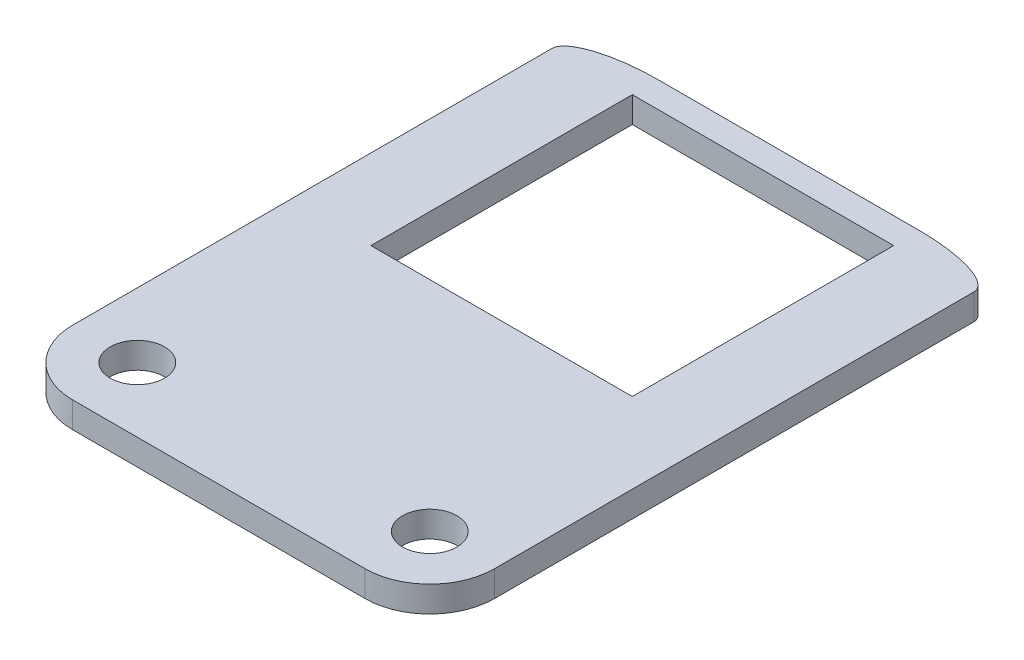
ISO-10303-21;
HEADER;
FILE_DESCRIPTION(('STEP AP214'),'2;1');
FILE_NAME('part.step','',(''),(''),'','','');
FILE_SCHEMA(('AUTOMOTIVE_DESIGN { 1 0 10303 214 1 1 1 1 }'));
ENDSEC;
DATA;
#1=APPLICATION_CONTEXT('core data for automotive mechanical design processes');
#2=APPLICATION_PROTOCOL_DEFINITION('international standard','automotive_design',2000,#1);
#3=PRODUCT_CONTEXT('',#1,'mechanical');
#4=PRODUCT('Part','Part','',(#3));
#5=PRODUCT_RELATED_PRODUCT_CATEGORY('part','',(#4));
#6=PRODUCT_DEFINITION_FORMATION('','',#4);
#7=PRODUCT_DEFINITION_CONTEXT('part definition',#1,'design');
#8=PRODUCT_DEFINITION('design','',#6,#7);
#9=PRODUCT_DEFINITION_SHAPE('','',#8);
#10=(LENGTH_UNIT() NAMED_UNIT(*) SI_UNIT(.MILLI.,.METRE.));
#11=(NAMED_UNIT(*) PLANE_ANGLE_UNIT() SI_UNIT($,.RADIAN.));
#12=(NAMED_UNIT(*) SI_UNIT($,.STERADIAN.) SOLID_ANGLE_UNIT());
#13=UNCERTAINTY_MEASURE_WITH_UNIT(LENGTH_MEASURE(1.E-05),#10,'distance_accuracy_value','');
#14=(GEOMETRIC_REPRESENTATION_CONTEXT(3) GLOBAL_UNCERTAINTY_ASSIGNED_CONTEXT((#13)) GLOBAL_UNIT_ASSIGNED_CONTEXT((#10,
#11,#12)) REPRESENTATION_CONTEXT('',''));
#15=CARTESIAN_POINT('',(0.,0.,0.));
#16=DIRECTION('',(0.,0.,1.));
#17=DIRECTION('',(1.,0.,0.));
#18=AXIS2_PLACEMENT_3D('',#15,#16,#17);
#19=CARTESIAN_POINT('',(0.,-62.,328.925000000001));
#20=DIRECTION('',(0.,-1.,0.));
#21=DIRECTION('',(0.,0.,-1.));
#22=AXIS2_PLACEMENT_3D('',#19,#20,#21);
#23=PLANE('',#22);
#24=CARTESIAN_POINT('',(-11.3000000000005,-62.,345.950000000001));
#25=DIRECTION('',(0.,-1.,0.));
#26=DIRECTION('',(0.,0.,-1.));
#27=AXIS2_PLACEMENT_3D('',#24,#25,#26);
#28=CIRCLE('',#27,2.10000000000002);
#29=CARTESIAN_POINT('',(-11.3000000000005,-62.,343.850000000001));
#30=VERTEX_POINT('',#29);
#31=EDGE_CURVE('E272',#30,#30,#28,.T.);
#32=ORIENTED_EDGE('',*,*,#31,.T.);
#33=EDGE_LOOP('',(#32));
#34=FACE_BOUND('',#33,.T.);
#35=DIRECTION('',(0.,0.,1.));
#36=VECTOR('',#35,1.);
#37=CARTESIAN_POINT('',(10.0999999999997,-62.,329.100000000001));
#38=LINE('',#37,#36);
#39=CARTESIAN_POINT('',(10.0999999999997,-62.,329.100000000001));
#40=VERTEX_POINT('',#39);
#41=CARTESIAN_POINT('',(10.0999999999997,-62.,308.900000000001));
#42=VERTEX_POINT('',#41);
#43=EDGE_CURVE('E290',#40,#42,#38,.F.);
#44=ORIENTED_EDGE('',*,*,#43,.F.);
#45=DIRECTION('',(-1.,0.,0.));
#46=VECTOR('',#45,1.);
#47=CARTESIAN_POINT('',(-10.1000000000007,-62.,329.100000000001));
#48=LINE('',#47,#46);
#49=CARTESIAN_POINT('',(-10.1000000000007,-62.,329.100000000001));
#50=VERTEX_POINT('',#49);
#51=EDGE_CURVE('E285',#50,#40,#48,.F.);
#52=ORIENTED_EDGE('',*,*,#51,.F.);
#53=DIRECTION('',(0.,0.,-1.));
#54=VECTOR('',#53,1.);
#55=CARTESIAN_POINT('',(-10.1000000000007,-62.,308.900000000001));
#56=LINE('',#55,#54);
#57=CARTESIAN_POINT('',(-10.1000000000007,-62.,308.900000000001));
#58=VERTEX_POINT('',#57);
#59=EDGE_CURVE('E279',#58,#50,#56,.F.);
#60=ORIENTED_EDGE('',*,*,#59,.F.);
#61=DIRECTION('',(1.,0.,0.));
#62=VECTOR('',#61,1.);
#63=CARTESIAN_POINT('',(10.0999999999997,-62.,308.900000000001));
#64=LINE('',#63,#62);
#65=EDGE_CURVE('E276',#42,#58,#64,.F.);
#66=ORIENTED_EDGE('',*,*,#65,.F.);
#67=EDGE_LOOP('',(#44,#52,#60,#66));
#68=FACE_BOUND('',#67,.T.);
#69=CARTESIAN_POINT('',(11.3000000000006,-62.,345.950000000001));
#70=DIRECTION('',(0.,-1.,0.));
#71=DIRECTION('',(0.,0.,-1.));
#72=AXIS2_PLACEMENT_3D('',#69,#70,#71);
#73=CIRCLE('',#72,2.10000000000001);
#74=CARTESIAN_POINT('',(11.3000000000006,-62.,343.850000000001));
#75=VERTEX_POINT('',#74);
#76=EDGE_CURVE('E274',#75,#75,#73,.T.);
#77=ORIENTED_EDGE('',*,*,#76,.T.);
#78=EDGE_LOOP('',(#77));
#79=FACE_BOUND('',#78,.T.);
#80=CARTESIAN_POINT('',(11.3000000000006,-62.,345.950000000001));
#81=DIRECTION('',(0.,-1.,0.));
#82=DIRECTION('',(0.,0.,-1.));
#83=AXIS2_PLACEMENT_3D('',#80,#81,#82);
#84=CIRCLE('',#83,5.);
#85=CARTESIAN_POINT('',(16.2999999468881,-62.,345.950841526774));
#86=VERTEX_POINT('',#85);
#87=CARTESIAN_POINT('',(11.299994687767,-62.,350.949999999996));
#88=VERTEX_POINT('',#87);
#89=EDGE_CURVE('E226',#86,#88,#84,.T.);
#90=ORIENTED_EDGE('',*,*,#89,.F.);
#91=DIRECTION('',(0.,0.,-1.));
#92=VECTOR('',#91,1.);
#93=CARTESIAN_POINT('',(16.3000000000007,-62.,308.89999998155));
#94=LINE('',#93,#92);
#95=CARTESIAN_POINT('',(16.3000000000007,-62.,308.89999998155));
#96=VERTEX_POINT('',#95);
#97=EDGE_CURVE('E131',#96,#86,#94,.F.);
#98=ORIENTED_EDGE('',*,*,#97,.F.);
#99=CARTESIAN_POINT('',(16.3000000000007,-62.,308.89999998155));
#100=CARTESIAN_POINT('',(16.3000100085411,-62.,308.879728518008));
#101=CARTESIAN_POINT('',(16.2990448951217,-62.,308.859463098504));
#102=CARTESIAN_POINT('',(16.2952426424189,-62.,308.819134871898));
#103=CARTESIAN_POINT('',(16.2924079903976,-62.,308.799071831504));
#104=CARTESIAN_POINT('',(16.2849906926115,-62.,308.759530438879));
#105=CARTESIAN_POINT('',(16.2804301182378,-62.,308.740047923314));
#106=CARTESIAN_POINT('',(16.2696902006696,-62.,308.701534913313));
#107=CARTESIAN_POINT('',(16.263510254768,-62.,308.682504590059));
#108=CARTESIAN_POINT('',(16.2390194544044,-62.,308.616111440497));
#109=CARTESIAN_POINT('',(16.2166699308531,-62.,308.570189935519));
#110=CARTESIAN_POINT('',(16.1779189662623,-62.,308.504425020752));
#111=CARTESIAN_POINT('',(16.1640805458818,-62.,308.48296224004));
#112=CARTESIAN_POINT('',(16.1349252787316,-62.,308.441063020324));
#113=CARTESIAN_POINT('',(16.1196087803228,-62.,308.420626341201));
#114=CARTESIAN_POINT('',(16.0764017660893,-62.,308.366562116323));
#115=CARTESIAN_POINT('',(16.0473163556789,-62.,308.333891206585));
#116=CARTESIAN_POINT('',(15.9864369985396,-62.,308.271154018153));
#117=CARTESIAN_POINT('',(15.9546401295631,-62.,308.241090621875));
#118=CARTESIAN_POINT('',(15.8888778941319,-62.,308.183168609427));
#119=CARTESIAN_POINT('',(15.8549040981756,-62.,308.155319632339));
#120=CARTESIAN_POINT('',(15.785367108241,-62.,308.101672415864));
#121=CARTESIAN_POINT('',(15.7498033004617,-62.,308.075874979312));
#122=CARTESIAN_POINT('',(15.6454047965702,-62.,308.004038076057));
#123=CARTESIAN_POINT('',(15.5749880349551,-62.,307.960296639418));
#124=CARTESIAN_POINT('',(15.4314174526433,-62.,307.87800983303));
#125=CARTESIAN_POINT('',(15.3582689721973,-62.,307.839454940348));
#126=CARTESIAN_POINT('',(15.2099517872253,-62.,307.766522381027));
#127=CARTESIAN_POINT('',(15.134783512399,-62.,307.732143834354));
#128=CARTESIAN_POINT('',(14.9821079768312,-62.,307.666519716972));
#129=CARTESIAN_POINT('',(14.904583961999,-62.,307.63531346816));
#130=CARTESIAN_POINT('',(14.7483843478808,-62.,307.575961476453));
#131=CARTESIAN_POINT('',(14.6697088099718,-62.,307.547815571108));
#132=CARTESIAN_POINT('',(14.511454310545,-62.,307.494191428494));
#133=CARTESIAN_POINT('',(14.4318752915955,-62.,307.468713361876));
#134=CARTESIAN_POINT('',(14.2099425972009,-62.,307.401247997226));
#135=CARTESIAN_POINT('',(14.066815245498,-62.,307.361798976393));
#136=CARTESIAN_POINT('',(13.7789595716801,-62.,307.289078168235));
#137=CARTESIAN_POINT('',(13.6342305811498,-62.,307.255809071585));
#138=CARTESIAN_POINT('',(13.3435008871367,-62.,307.194592723583));
#139=CARTESIAN_POINT('',(13.1974990163697,-62.,307.166651049831));
#140=CARTESIAN_POINT('',(12.9045229551377,-62.,307.115501831141));
#141=CARTESIAN_POINT('',(12.7575479307118,-62.,307.09229910222));
#142=CARTESIAN_POINT('',(12.4628897277137,-62.,307.050210959056));
#143=CARTESIAN_POINT('',(12.3152061605066,-62.,307.031328280851));
#144=CARTESIAN_POINT('',(12.0296294564598,-62.,306.998747787763));
#145=CARTESIAN_POINT('',(11.891766713781,-62.,306.984781436656));
#146=CARTESIAN_POINT('',(11.6158399217893,-62.,306.960147192543));
#147=CARTESIAN_POINT('',(11.4777760663218,-62.,306.949477120687));
#148=CARTESIAN_POINT('',(11.2016639746526,-62.,306.931302422769));
#149=CARTESIAN_POINT('',(11.063616069925,-62.,306.923792737161));
#150=CARTESIAN_POINT('',(10.7877509907875,-62.,306.911836981573));
#151=CARTESIAN_POINT('',(10.6499341607378,-62.,306.907382928754));
#152=CARTESIAN_POINT('',(10.3747444072694,-62.,306.901473049523));
#153=CARTESIAN_POINT('',(10.2373717204658,-62.,306.900006230125));
#154=CARTESIAN_POINT('',(10.0999999999997,-62.,306.900000000001));
#155=B_SPLINE_CURVE_WITH_KNOTS('',3,(#99,#100,#101,#102,#103,#104,#105,#106,#107,#108,#109,#110,
#111,#112,#113,#114,#115,#116,#117,#118,#119,#120,#121,#122,#123,#124,#125,#126,#127,#128,#129,
#130,#131,#132,#133,#134,#135,#136,#137,#138,#139,#140,#141,#142,#143,#144,#145,#146,#147,#148,
#149,#150,#151,#152,#153,#154),.UNSPECIFIED.,.F.,.F.,(4,2,2,2,2,2,2,2,2,2,2,2,2,2,2,2,2,2,2,2,2,
2,2,2,2,2,2,4),(0.,0.0607815976869053,0.121482493309521,0.181432019438633,0.241403889705722,
0.393615568069162,0.470190355402948,0.546747139079006,0.67775591339842,0.808907710140001,
0.940602262455932,1.07234810006941,1.32072542681598,1.56864029911551,1.81650284013316,
2.06713636807378,2.31775658538175,2.5683928241286,3.01360067644695,3.45900191571426,
3.90486694208287,4.35118285466339,4.79778065683387,5.21344504234127,5.62883408155378,
6.04355556010822,6.45718941050604,6.86929832228135),.UNSPECIFIED.);
#156=CARTESIAN_POINT('',(10.0999999999997,-62.,306.900000000001));
#157=VERTEX_POINT('',#156);
#158=EDGE_CURVE('E135',#96,#157,#155,.T.);
#159=ORIENTED_EDGE('',*,*,#158,.T.);
#160=DIRECTION('',(-1.,0.,0.));
#161=VECTOR('',#160,1.);
#162=CARTESIAN_POINT('',(-10.1000000000007,-62.,306.900000000001));
#163=LINE('',#162,#161);
#164=CARTESIAN_POINT('',(-10.1000000000007,-62.,306.900000000001));
#165=VERTEX_POINT('',#164);
#166=EDGE_CURVE('E137',#165,#157,#163,.F.);
#167=ORIENTED_EDGE('',*,*,#166,.F.);
#168=CARTESIAN_POINT('',(-10.1000000000007,-62.,306.900000000001));
#169=CARTESIAN_POINT('',(-10.2650318898521,-62.,306.900013120821));
#170=CARTESIAN_POINT('',(-10.4300661555279,-62.,306.90212620801));
#171=CARTESIAN_POINT('',(-10.7605419813453,-62.,306.910658313488));
#172=CARTESIAN_POINT('',(-10.9259831914275,-62.,306.917090843785));
#173=CARTESIAN_POINT('',(-11.2569520288186,-62.,306.934385440889));
#174=CARTESIAN_POINT('',(-11.4224792189309,-62.,306.945255934202));
#175=CARTESIAN_POINT('',(-11.7532936260872,-62.,306.971634398345));
#176=CARTESIAN_POINT('',(-11.9185805616217,-62.,306.987145920403));
#177=CARTESIAN_POINT('',(-12.2537553770801,-62.,307.023656208239));
#178=CARTESIAN_POINT('',(-12.4236264349943,-62.,307.044810659583));
#179=CARTESIAN_POINT('',(-12.7624485399478,-62.,307.092811267607));
#180=CARTESIAN_POINT('',(-12.9314001475735,-62.,307.119653431273));
#181=CARTESIAN_POINT('',(-13.2680086840991,-62.,307.179683725545));
#182=CARTESIAN_POINT('',(-13.4356667239261,-62.,307.212865582061));
#183=CARTESIAN_POINT('',(-13.7692820553021,-62.,307.286538619892));
#184=CARTESIAN_POINT('',(-13.9352404008119,-62.,307.327024940232));
#185=CARTESIAN_POINT('',(-14.202242660908,-62.,307.399759166458));
#186=CARTESIAN_POINT('',(-14.3040236959645,-62.,307.429303974072));
#187=CARTESIAN_POINT('',(-14.5064047579636,-62.,307.492298212841));
#188=CARTESIAN_POINT('',(-14.6070045315295,-62.,307.525748465453));
#189=CARTESIAN_POINT('',(-14.8060696673613,-62.,307.59704081032));
#190=CARTESIAN_POINT('',(-14.9045432971055,-62.,307.634859640214));
#191=CARTESIAN_POINT('',(-15.0992034239021,-62.,307.715936318828));
#192=CARTESIAN_POINT('',(-15.1953909807067,-62.,307.759191586507));
#193=CARTESIAN_POINT('',(-15.3667839122325,-62.,307.843790657609));
#194=CARTESIAN_POINT('',(-15.4425523078347,-62.,307.883982106607));
#195=CARTESIAN_POINT('',(-15.5910519391624,-62.,307.969997666398));
#196=CARTESIAN_POINT('',(-15.6637769504923,-62.,308.015832630767));
#197=CARTESIAN_POINT('',(-15.8050272151253,-62.,308.115017250356));
#198=CARTESIAN_POINT('',(-15.8735112184994,-62.,308.168427837207));
#199=CARTESIAN_POINT('',(-15.9699580097744,-62.,308.255435548739));
#200=CARTESIAN_POINT('',(-16.0010419635024,-62.,308.285564613478));
#201=CARTESIAN_POINT('',(-16.0604310779969,-62.,308.348429848913));
#202=CARTESIAN_POINT('',(-16.0887387431776,-62.,308.381163620772));
#203=CARTESIAN_POINT('',(-16.1429782241518,-62.,308.451211829635));
#204=CARTESIAN_POINT('',(-16.168723809156,-62.,308.488672612732));
#205=CARTESIAN_POINT('',(-16.2145738657989,-62.,308.566783672986));
#206=CARTESIAN_POINT('',(-16.2347032736816,-62.,308.607418791508));
#207=CARTESIAN_POINT('',(-16.2589091180891,-62.,308.669253811338));
#208=CARTESIAN_POINT('',(-16.2658421406671,-62.,308.689352789806));
#209=CARTESIAN_POINT('',(-16.277909115754,-62.,308.730083396813));
#210=CARTESIAN_POINT('',(-16.2830437028793,-62.,308.750714834697));
#211=CARTESIAN_POINT('',(-16.2914107881164,-62.,308.792660853489));
#212=CARTESIAN_POINT('',(-16.2946159130133,-62.,308.813980940766));
#213=CARTESIAN_POINT('',(-16.2989185615612,-62.,308.856864532933));
#214=CARTESIAN_POINT('',(-16.3000128445492,-62.,308.878428361061));
#215=CARTESIAN_POINT('',(-16.3000000000006,-62.,308.900000000001));
#216=B_SPLINE_CURVE_WITH_KNOTS('',3,(#168,#169,#170,#171,#172,#173,#174,#175,#176,#177,#178,
#179,#180,#181,#182,#183,#184,#185,#186,#187,#188,#189,#190,#191,#192,#193,#194,#195,#196,#197,
#198,#199,#200,#201,#202,#203,#204,#205,#206,#207,#208,#209,#210,#211,#212,#213,#214,#215),
.UNSPECIFIED.,.F.,.F.,(4,2,2,2,2,2,2,2,2,2,2,2,2,2,2,2,2,2,2,2,2,2,2,4),(0.,0.495085999023218,
0.99172797741825,1.48931736457768,1.98728847571649,2.50075036294524,3.0138529655831,
3.52645038107643,4.03870792301311,4.35659273467388,4.67454452982085,4.99087517793098,
5.30705620598718,5.5641733696776,5.82179297830308,6.08161644692631,6.21135710717521,
6.34097963415995,6.47700007326543,6.61240659519395,6.67612114820257,6.73981319546638,
6.80438875934789,6.86906338399137),.UNSPECIFIED.);
#217=CARTESIAN_POINT('',(-16.3000000000006,-62.,308.900000000001));
#218=VERTEX_POINT('',#217);
#219=EDGE_CURVE('E108',#165,#218,#216,.T.);
#220=ORIENTED_EDGE('',*,*,#219,.T.);
#221=DIRECTION('',(0.,0.,1.));
#222=VECTOR('',#221,1.);
#223=CARTESIAN_POINT('',(-16.3000000000006,-62.,345.950000000001));
#224=LINE('',#223,#222);
#225=CARTESIAN_POINT('',(-16.3000000000006,-62.,345.950000000001));
#226=VERTEX_POINT('',#225);
#227=EDGE_CURVE('E106',#226,#218,#224,.F.);
#228=ORIENTED_EDGE('',*,*,#227,.F.);
#229=CARTESIAN_POINT('',(-11.3000000000005,-62.,345.950000000001));
#230=DIRECTION('',(0.,-1.,0.));
#231=DIRECTION('',(0.,0.,-1.));
#232=AXIS2_PLACEMENT_3D('',#229,#230,#231);
#233=CIRCLE('',#232,5.);
#234=CARTESIAN_POINT('',(-11.3000000000005,-62.,350.950000000001));
#235=VERTEX_POINT('',#234);
#236=EDGE_CURVE('E20',#235,#226,#233,.T.);
#237=ORIENTED_EDGE('',*,*,#236,.F.);
#238=DIRECTION('',(1.,0.,0.));
#239=VECTOR('',#238,1.);
#240=CARTESIAN_POINT('',(11.2999911462779,-62.,350.950000000001));
#241=LINE('',#240,#239);
#242=EDGE_CURVE('E120',#88,#235,#241,.F.);
#243=ORIENTED_EDGE('',*,*,#242,.F.);
#244=EDGE_LOOP('',(#90,#98,#159,#167,#220,#228,#237,#243));
#245=FACE_BOUND('',#244,.T.);
#246=ADVANCED_FACE('F16',(#34,#68,#79,#245),#23,.F.);
#247=CARTESIAN_POINT('',(11.2999911462779,-62.,350.950000000001));
#248=DIRECTION('',(0.,0.,1.));
#249=DIRECTION('',(1.,0.,0.));
#250=AXIS2_PLACEMENT_3D('',#247,#248,#249);
#251=PLANE('',#250);
#252=DIRECTION('',(1.,0.,0.));
#253=VECTOR('',#252,1.);
#254=CARTESIAN_POINT('',(0.,-64.,350.949999999993));
#255=LINE('',#254,#253);
#256=CARTESIAN_POINT('',(11.299994687767,-64.,350.949999999993));
#257=VERTEX_POINT('',#256);
#258=CARTESIAN_POINT('',(-11.3000000000005,-64.,350.949999999997));
#259=VERTEX_POINT('',#258);
#260=EDGE_CURVE('E269',#257,#259,#255,.F.);
#261=ORIENTED_EDGE('',*,*,#260,.F.);
#262=DIRECTION('',(0.,-1.,0.));
#263=VECTOR('',#262,1.);
#264=CARTESIAN_POINT('',(11.2999911462779,-62.,350.949999999993));
#265=LINE('',#264,#263);
#266=EDGE_CURVE('E229',#88,#257,#265,.T.);
#267=ORIENTED_EDGE('',*,*,#266,.F.);
#268=ORIENTED_EDGE('',*,*,#242,.T.);
#269=DIRECTION('',(0.,-1.,0.));
#270=VECTOR('',#269,1.);
#271=CARTESIAN_POINT('',(-11.3000000000005,-62.,350.950000000001));
#272=LINE('',#271,#270);
#273=EDGE_CURVE('E113',#259,#235,#272,.F.);
#274=ORIENTED_EDGE('',*,*,#273,.F.);
#275=EDGE_LOOP('',(#261,#267,#268,#274));
#276=FACE_BOUND('',#275,.T.);
#277=ADVANCED_FACE('F260',(#276),#251,.T.);
#278=CARTESIAN_POINT('',(-11.3000000000005,-62.,345.950000000001));
#279=DIRECTION('',(0.,-1.,0.));
#280=DIRECTION('',(0.,0.,-1.));
#281=AXIS2_PLACEMENT_3D('',#278,#279,#280);
#282=CYLINDRICAL_SURFACE('',#281,5.);
#283=CARTESIAN_POINT('',(-11.3000000000005,-64.,345.950000000001));
#284=DIRECTION('',(0.,-1.,0.));
#285=DIRECTION('',(0.,0.,-1.));
#286=AXIS2_PLACEMENT_3D('',#283,#284,#285);
#287=CIRCLE('',#286,5.);
#288=CARTESIAN_POINT('',(-16.3000000000006,-64.,345.950000000001));
#289=VERTEX_POINT('',#288);
#290=EDGE_CURVE('E271',#259,#289,#287,.T.);
#291=ORIENTED_EDGE('',*,*,#290,.F.);
#292=ORIENTED_EDGE('',*,*,#273,.T.);
#293=ORIENTED_EDGE('',*,*,#236,.T.);
#294=DIRECTION('',(0.,1.,0.));
#295=VECTOR('',#294,1.);
#296=CARTESIAN_POINT('',(-16.3000000000006,-62.,345.950000000001));
#297=LINE('',#296,#295);
#298=EDGE_CURVE('E112',#289,#226,#297,.T.);
#299=ORIENTED_EDGE('',*,*,#298,.F.);
#300=EDGE_LOOP('',(#291,#292,#293,#299));
#301=FACE_BOUND('',#300,.T.);
#302=ADVANCED_FACE('F118',(#301),#282,.T.);
#303=CARTESIAN_POINT('',(-16.3000000000006,-62.,345.950000000001));
#304=DIRECTION('',(-1.,0.,0.));
#305=DIRECTION('',(0.,0.,1.));
#306=AXIS2_PLACEMENT_3D('',#303,#304,#305);
#307=PLANE('',#306);
#308=DIRECTION('',(0.,0.,-1.));
#309=VECTOR('',#308,1.);
#310=CARTESIAN_POINT('',(-16.3000000000005,-64.,328.925000000001));
#311=LINE('',#310,#309);
#312=CARTESIAN_POINT('',(-16.3000000000006,-64.,308.900000000001));
#313=VERTEX_POINT('',#312);
#314=EDGE_CURVE('E123',#289,#313,#311,.T.);
#315=ORIENTED_EDGE('',*,*,#314,.F.);
#316=ORIENTED_EDGE('',*,*,#298,.T.);
#317=ORIENTED_EDGE('',*,*,#227,.T.);
#318=DIRECTION('',(0.,-1.,0.));
#319=VECTOR('',#318,1.);
#320=CARTESIAN_POINT('',(-16.3000000000006,-63.,308.900000000001));
#321=LINE('',#320,#319);
#322=EDGE_CURVE('E125',#218,#313,#321,.T.);
#323=ORIENTED_EDGE('',*,*,#322,.T.);
#324=EDGE_LOOP('',(#315,#316,#317,#323));
#325=FACE_BOUND('',#324,.T.);
#326=ADVANCED_FACE('F121',(#325),#307,.T.);
#327=CARTESIAN_POINT('',(-16.3000000000006,-62.,308.900000000001));
#328=CARTESIAN_POINT('',(-16.3000000000006,-62.,306.900000000001));
#329=CARTESIAN_POINT('',(-10.1000000000007,-62.,306.900000000001));
#330=CARTESIAN_POINT('',(-16.3000000000006,-64.,308.900000000001));
#331=CARTESIAN_POINT('',(-16.3000000000006,-64.,306.900000000001));
#332=CARTESIAN_POINT('',(-10.1000000000007,-64.,306.900000000001));
#333=(BOUNDED_SURFACE() B_SPLINE_SURFACE(1,2,((#327,#328,#329),(#330,#331,#332)),.UNSPECIFIED.,
.F.,.F.,.F.) B_SPLINE_SURFACE_WITH_KNOTS((2,2),(3,3),(0.,0.322580645161295),(-3.14159265358979,
-1.5707963267949),.UNSPECIFIED.) GEOMETRIC_REPRESENTATION_ITEM() RATIONAL_B_SPLINE_SURFACE(((1.,
0.707106781186548,1.),(1.,0.707106781186548,1.))) REPRESENTATION_ITEM('') SURFACE());
#334=DIRECTION('',(0.,1.,0.));
#335=VECTOR('',#334,1.);
#336=CARTESIAN_POINT('',(-10.1000000000007,-62.,306.900000000001));
#337=LINE('',#336,#335);
#338=CARTESIAN_POINT('',(-10.1000000000007,-64.,306.900000000001));
#339=VERTEX_POINT('',#338);
#340=EDGE_CURVE('E138',#339,#165,#337,.T.);
#341=CARTESIAN_POINT('',(-16.3000000000006,-64.,308.900000000001));
#342=CARTESIAN_POINT('',(-16.3000100091206,-64.,308.879728536788));
#343=CARTESIAN_POINT('',(-16.2990448963119,-64.,308.859463117584));
#344=CARTESIAN_POINT('',(-16.2952426448709,-64.,308.819134891512));
#345=CARTESIAN_POINT('',(-16.2924079935002,-64.,308.799071851355));
#346=CARTESIAN_POINT('',(-16.284990697025,-64.,308.759530459129));
#347=CARTESIAN_POINT('',(-16.2804301233104,-64.,308.740047943729));
#348=CARTESIAN_POINT('',(-16.2696902070615,-64.,308.701534934005));
#349=CARTESIAN_POINT('',(-16.2635102618201,-64.,308.682504610864));
#350=CARTESIAN_POINT('',(-16.2390194641299,-64.,308.616111462598));
#351=CARTESIAN_POINT('',(-16.2166699427526,-64.,308.570189958613));
#352=CARTESIAN_POINT('',(-16.1779189814766,-64.,308.504425045104));
#353=CARTESIAN_POINT('',(-16.1640805622173,-64.,308.482962264779));
#354=CARTESIAN_POINT('',(-16.1349252973142,-64.,308.441063045771));
#355=CARTESIAN_POINT('',(-16.1196088000312,-64.,308.420626366969));
#356=CARTESIAN_POINT('',(-16.0764017895002,-64.,308.366562143715));
#357=CARTESIAN_POINT('',(-16.047316381749,-64.,308.333891235159));
#358=CARTESIAN_POINT('',(-15.9864370300087,-64.,308.271154048872));
#359=CARTESIAN_POINT('',(-15.9546401637721,-64.,308.241090653557));
#360=CARTESIAN_POINT('',(-15.8888779338727,-64.,308.183168642872));
#361=CARTESIAN_POINT('',(-15.8549041407086,-64.,308.155319666582));
#362=CARTESIAN_POINT('',(-15.7853671563769,-64.,308.101672451573));
#363=CARTESIAN_POINT('',(-15.7498033514084,-64.,308.075875015686));
#364=CARTESIAN_POINT('',(-15.6454048576933,-64.,308.004038115617));
#365=CARTESIAN_POINT('',(-15.5749881035848,-64.,307.960296681172));
#366=CARTESIAN_POINT('',(-15.4314175364,-64.,307.878009878628));
#367=CARTESIAN_POINT('',(-15.3582690635739,-64.,307.839454987597));
#368=CARTESIAN_POINT('',(-15.2099518939101,-64.,307.766522431173));
#369=CARTESIAN_POINT('',(-15.134783626772,-64.,307.732143885745));
#370=CARTESIAN_POINT('',(-14.9821081066718,-64.,307.666519770527));
#371=CARTESIAN_POINT('',(-14.9045840996189,-64.,307.635313522633));
#372=CARTESIAN_POINT('',(-14.7483845010769,-64.,307.575961532484));
#373=CARTESIAN_POINT('',(-14.6697089709649,-64.,307.547815627781));
#374=CARTESIAN_POINT('',(-14.5114544871422,-64.,307.494191486215));
#375=CARTESIAN_POINT('',(-14.4318754759998,-64.,307.468713420003));
#376=CARTESIAN_POINT('',(-14.2099427829794,-64.,307.401248050011));
#377=CARTESIAN_POINT('',(-14.0668154245227,-64.,307.361799024262));
#378=CARTESIAN_POINT('',(-13.7789597368058,-64.,307.289078207313));
#379=CARTESIAN_POINT('',(-13.63423073913,-64.,307.255809106789));
#380=CARTESIAN_POINT('',(-13.3435010305295,-64.,307.194592751834));
#381=CARTESIAN_POINT('',(-13.1974991523201,-64.,307.166651075005));
#382=CARTESIAN_POINT('',(-12.9045230759921,-64.,307.115501850801));
#383=CARTESIAN_POINT('',(-12.7575480439124,-64.,307.092299119447));
#384=CARTESIAN_POINT('',(-12.4628898254674,-64.,307.050210971961));
#385=CARTESIAN_POINT('',(-12.315206250467,-64.,307.031328291868));
#386=CARTESIAN_POINT('',(-12.0296295330434,-64.,306.998747795799));
#387=CARTESIAN_POINT('',(-11.8917667847912,-64.,306.98478144352));
#388=CARTESIAN_POINT('',(-11.6158399816473,-64.,306.960147197363));
#389=CARTESIAN_POINT('',(-11.4777761206013,-64.,306.949477124632));
#390=CARTESIAN_POINT('',(-11.2016640178234,-64.,306.93130242524));
#391=CARTESIAN_POINT('',(-11.0636161075657,-64.,306.92379273903));
#392=CARTESIAN_POINT('',(-10.7877510174693,-64.,306.911836982493));
#393=CARTESIAN_POINT('',(-10.6499341819909,-64.,306.907382929325));
#394=CARTESIAN_POINT('',(-10.3747444178193,-64.,306.901473049636));
#395=CARTESIAN_POINT('',(-10.2373717257411,-64.,306.900006230126));
#396=CARTESIAN_POINT('',(-10.1000000000007,-64.,306.900000000001));
#397=B_SPLINE_CURVE_WITH_KNOTS('',3,(#341,#342,#343,#344,#345,#346,#347,#348,#349,#350,#351,
#352,#353,#354,#355,#356,#357,#358,#359,#360,#361,#362,#363,#364,#365,#366,#367,#368,#369,#370,
#371,#372,#373,#374,#375,#376,#377,#378,#379,#380,#381,#382,#383,#384,#385,#386,#387,#388,#389,
#390,#391,#392,#393,#394,#395,#396),.UNSPECIFIED.,.F.,.F.,(4,2,2,2,2,2,2,2,2,2,2,2,2,2,2,2,2,2,
2,2,2,2,2,2,2,2,2,4),(0.,0.0607815967041928,0.12148249135508,0.181432016554213,0.24140388588782,
0.393615558758374,0.470190343293343,0.54674712417284,0.677755890552316,0.808907679341882,
0.94060222366349,1.07234805327953,1.32072535745766,1.56864020723554,1.81650272573294,
2.06713623100206,2.31775642564111,2.56839264171384,3.01360051742009,3.45900178015446,
3.90486683016623,4.35118276655115,4.79778059261908,5.21344499511026,5.62883405120562,
6.04355554641961,6.45718941312489,6.86929834072259),.UNSPECIFIED.);
#398=EDGE_CURVE('E157',#313,#339,#397,.T.);
#399=ORIENTED_EDGE('',*,*,#340,.F.);
#400=ORIENTED_EDGE('',*,*,#398,.F.);
#401=ORIENTED_EDGE('',*,*,#322,.F.);
#402=ORIENTED_EDGE('',*,*,#219,.F.);
#403=EDGE_LOOP('',(#399,#400,#401,#402));
#404=FACE_BOUND('',#403,.T.);
#405=ADVANCED_FACE('F238',(#404),#333,.F.);
#406=CARTESIAN_POINT('',(-10.1000000000007,-62.,306.900000000001));
#407=DIRECTION('',(0.,0.,-1.));
#408=DIRECTION('',(-1.,0.,0.));
#409=AXIS2_PLACEMENT_3D('',#406,#407,#408);
#410=PLANE('',#409);
#411=DIRECTION('',(1.,0.,0.));
#412=VECTOR('',#411,1.);
#413=CARTESIAN_POINT('',(0.,-64.,306.900000000001));
#414=LINE('',#413,#412);
#415=CARTESIAN_POINT('',(10.0999999999997,-64.,306.900000000001));
#416=VERTEX_POINT('',#415);
#417=EDGE_CURVE('E156',#339,#416,#414,.T.);
#418=ORIENTED_EDGE('',*,*,#417,.F.);
#419=ORIENTED_EDGE('',*,*,#340,.T.);
#420=ORIENTED_EDGE('',*,*,#166,.T.);
#421=DIRECTION('',(0.,-1.,0.));
#422=VECTOR('',#421,1.);
#423=CARTESIAN_POINT('',(10.0999999999997,-63.,306.900000000001));
#424=LINE('',#423,#422);
#425=EDGE_CURVE('E224',#157,#416,#424,.T.);
#426=ORIENTED_EDGE('',*,*,#425,.T.);
#427=EDGE_LOOP('',(#418,#419,#420,#426));
#428=FACE_BOUND('',#427,.T.);
#429=ADVANCED_FACE('F208',(#428),#410,.T.);
#430=CARTESIAN_POINT('',(10.0999999999997,-62.,306.900000000001));
#431=CARTESIAN_POINT('',(16.299999942801,-62.,306.900000000001));
#432=CARTESIAN_POINT('',(16.3000000000007,-62.,308.89999998155));
#433=CARTESIAN_POINT('',(10.0999999999997,-64.,306.900000000001));
#434=CARTESIAN_POINT('',(16.299999942801,-64.,306.900000000001));
#435=CARTESIAN_POINT('',(16.3000000000007,-64.,308.89999998155));
#436=(BOUNDED_SURFACE() B_SPLINE_SURFACE(1,2,((#430,#431,#432),(#433,#434,#435)),.UNSPECIFIED.,
.F.,.F.,.F.) B_SPLINE_SURFACE_WITH_KNOTS((2,2),(3,3),(0.,0.322580645161242),(-1.5707963267949,
-9.22575793538308E-09),
.UNSPECIFIED.) GEOMETRIC_REPRESENTATION_ITEM() RATIONAL_B_SPLINE_SURFACE(((1.,0.707106784448345,
1.),(1.,0.707106784448345,1.))) REPRESENTATION_ITEM('') SURFACE());
#437=DIRECTION('',(0.,1.,0.));
#438=VECTOR('',#437,1.);
#439=CARTESIAN_POINT('',(16.3000000000007,-62.,308.89999998155));
#440=LINE('',#439,#438);
#441=CARTESIAN_POINT('',(16.3000000000007,-64.,308.89999998155));
#442=VERTEX_POINT('',#441);
#443=EDGE_CURVE('E134',#442,#96,#440,.T.);
#444=CARTESIAN_POINT('',(10.0999999999997,-64.,306.900000000001));
#445=CARTESIAN_POINT('',(10.265031889855,-64.,306.900013120821));
#446=CARTESIAN_POINT('',(10.4300661555348,-64.,306.90212620801));
#447=CARTESIAN_POINT('',(10.7605419813601,-64.,306.910658313488));
#448=CARTESIAN_POINT('',(10.9259831914462,-64.,306.917090843786));
#449=CARTESIAN_POINT('',(11.256952028845,-64.,306.934385440891));
#450=CARTESIAN_POINT('',(11.4224792189611,-64.,306.945255934204));
#451=CARTESIAN_POINT('',(11.7532936261251,-64.,306.971634398348));
#452=CARTESIAN_POINT('',(11.9185805616633,-64.,306.987145920408));
#453=CARTESIAN_POINT('',(12.2537553771215,-64.,307.023656208244));
#454=CARTESIAN_POINT('',(12.4236264350318,-64.,307.044810659588));
#455=CARTESIAN_POINT('',(12.7624485399773,-64.,307.092811267612));
#456=CARTESIAN_POINT('',(12.9314001475991,-64.,307.119653431278));
#457=CARTESIAN_POINT('',(13.2680086841169,-64.,307.179683725549));
#458=CARTESIAN_POINT('',(13.43566672394,-64.,307.212865582064));
#459=CARTESIAN_POINT('',(13.7692820553085,-64.,307.286538619894));
#460=CARTESIAN_POINT('',(13.9352404008146,-64.,307.327024940233));
#461=CARTESIAN_POINT('',(14.2022426607088,-64.,307.399759166404));
#462=CARTESIAN_POINT('',(14.3040236955688,-64.,307.429303973957));
#463=CARTESIAN_POINT('',(14.5064047571799,-64.,307.492298212589));
#464=CARTESIAN_POINT('',(14.6070045305543,-64.,307.525748465124));
#465=CARTESIAN_POINT('',(14.8060696660109,-64.,307.597040809817));
#466=CARTESIAN_POINT('',(14.9045432955714,-64.,307.634859639613));
#467=CARTESIAN_POINT('',(15.0992034220142,-64.,307.715936318005));
#468=CARTESIAN_POINT('',(15.1953909786487,-64.,307.759191585559));
#469=CARTESIAN_POINT('',(15.3667839107705,-64.,307.843790656834));
#470=CARTESIAN_POINT('',(15.4425523071094,-64.,307.883982106188));
#471=CARTESIAN_POINT('',(15.5910519398608,-64.,307.969997666802));
#472=CARTESIAN_POINT('',(15.6637769518773,-64.,308.015832631638));
#473=CARTESIAN_POINT('',(15.8050272178063,-64.,308.115017252341));
#474=CARTESIAN_POINT('',(15.8735112217871,-64.,308.168427839842));
#475=CARTESIAN_POINT('',(15.969958013777,-64.,308.255435552515));
#476=CARTESIAN_POINT('',(16.0010419677082,-64.,308.285564617658));
#477=CARTESIAN_POINT('',(16.060431082515,-64.,308.348429853968));
#478=CARTESIAN_POINT('',(16.0887387478049,-64.,308.381163626296));
#479=CARTESIAN_POINT('',(16.1429782286656,-64.,308.451211835939));
#480=CARTESIAN_POINT('',(16.168723813469,-64.,308.488672619327));
#481=CARTESIAN_POINT('',(16.2145738695842,-64.,308.566783680182));
#482=CARTESIAN_POINT('',(16.2347032771401,-64.,308.607418799016));
#483=CARTESIAN_POINT('',(16.2589091201325,-64.,308.669253817185));
#484=CARTESIAN_POINT('',(16.2658421418553,-64.,308.689352793629));
#485=CARTESIAN_POINT('',(16.2779091155979,-64.,308.730083396474));
#486=CARTESIAN_POINT('',(16.2830437022337,-64.,308.750714832221));
#487=CARTESIAN_POINT('',(16.2914107868908,-64.,308.792660846577));
#488=CARTESIAN_POINT('',(16.2946159117088,-64.,308.813980931553));
#489=CARTESIAN_POINT('',(16.2989185605574,-64.,308.856864519097));
#490=CARTESIAN_POINT('',(16.3000128439265,-64.,308.878428344903));
#491=CARTESIAN_POINT('',(16.3000000000007,-64.,308.89999998155));
#492=B_SPLINE_CURVE_WITH_KNOTS('',3,(#444,#445,#446,#447,#448,#449,#450,#451,#452,#453,#454,
#455,#456,#457,#458,#459,#460,#461,#462,#463,#464,#465,#466,#467,#468,#469,#470,#471,#472,#473,
#474,#475,#476,#477,#478,#479,#480,#481,#482,#483,#484,#485,#486,#487,#488,#489,#490,#491),
.UNSPECIFIED.,.F.,.F.,(4,2,2,2,2,2,2,2,2,2,2,2,2,2,2,2,2,2,2,2,2,2,2,4),(0.,0.495085999035096,
0.991727977441836,1.48931736461286,1.98728847576317,2.50075036298007,3.01385296560613,
3.52645038108784,4.03870792301309,4.35659273405755,4.67454452858729,4.99087517607866,
5.30705620351849,5.56417336965714,5.82179298076579,6.08161645199255,6.21135711351863,
6.34097964177217,6.47700008124394,6.61240660354878,6.67612115000357,6.73981319071821,
6.80438874777144,6.8690633655494),.UNSPECIFIED.);
#493=EDGE_CURVE('E148',#416,#442,#492,.T.);
#494=ORIENTED_EDGE('',*,*,#443,.F.);
#495=ORIENTED_EDGE('',*,*,#493,.F.);
#496=ORIENTED_EDGE('',*,*,#425,.F.);
#497=ORIENTED_EDGE('',*,*,#158,.F.);
#498=EDGE_LOOP('',(#494,#495,#496,#497));
#499=FACE_BOUND('',#498,.T.);
#500=ADVANCED_FACE('F163',(#499),#436,.F.);
#501=CARTESIAN_POINT('',(16.3000000000007,-62.,308.89999998155));
#502=DIRECTION('',(1.,0.,0.));
#503=DIRECTION('',(0.,0.,-1.));
#504=AXIS2_PLACEMENT_3D('',#501,#502,#503);
#505=PLANE('',#504);
#506=DIRECTION('',(0.,0.,-1.));
#507=VECTOR('',#506,1.);
#508=CARTESIAN_POINT('',(16.3000000000007,-64.,328.925000000001));
#509=LINE('',#508,#507);
#510=CARTESIAN_POINT('',(16.2999999468881,-64.,345.950841526774));
#511=VERTEX_POINT('',#510);
#512=EDGE_CURVE('E147',#442,#511,#509,.F.);
#513=ORIENTED_EDGE('',*,*,#512,.F.);
#514=ORIENTED_EDGE('',*,*,#443,.T.);
#515=ORIENTED_EDGE('',*,*,#97,.T.);
#516=DIRECTION('',(0.,-1.,0.));
#517=VECTOR('',#516,1.);
#518=CARTESIAN_POINT('',(16.2999999291839,-62.,345.950841526774));
#519=LINE('',#518,#517);
#520=EDGE_CURVE('E214',#511,#86,#519,.F.);
#521=ORIENTED_EDGE('',*,*,#520,.F.);
#522=EDGE_LOOP('',(#513,#514,#515,#521));
#523=FACE_BOUND('',#522,.T.);
#524=ADVANCED_FACE('F200',(#523),#505,.T.);
#525=CARTESIAN_POINT('',(11.3000000000006,-62.,345.950000000001));
#526=DIRECTION('',(0.,-1.,0.));
#527=DIRECTION('',(0.,0.,-1.));
#528=AXIS2_PLACEMENT_3D('',#525,#526,#527);
#529=CYLINDRICAL_SURFACE('',#528,5.);
#530=CARTESIAN_POINT('',(11.3000000000006,-64.,345.950000000001));
#531=DIRECTION('',(0.,-1.,0.));
#532=DIRECTION('',(0.,0.,-1.));
#533=AXIS2_PLACEMENT_3D('',#530,#531,#532);
#534=CIRCLE('',#533,5.);
#535=EDGE_CURVE('E144',#511,#257,#534,.T.);
#536=ORIENTED_EDGE('',*,*,#535,.F.);
#537=ORIENTED_EDGE('',*,*,#520,.T.);
#538=ORIENTED_EDGE('',*,*,#89,.T.);
#539=ORIENTED_EDGE('',*,*,#266,.T.);
#540=EDGE_LOOP('',(#536,#537,#538,#539));
#541=FACE_BOUND('',#540,.T.);
#542=ADVANCED_FACE('F197',(#541),#529,.T.);
#543=CARTESIAN_POINT('',(11.3000000000006,-62.,345.950000000001));
#544=DIRECTION('',(0.,-1.,0.));
#545=DIRECTION('',(0.,0.,-1.));
#546=AXIS2_PLACEMENT_3D('',#543,#544,#545);
#547=CYLINDRICAL_SURFACE('',#546,2.10000000000001);
#548=ORIENTED_EDGE('',*,*,#76,.F.);
#549=EDGE_LOOP('',(#548));
#550=FACE_BOUND('',#549,.T.);
#551=CARTESIAN_POINT('',(11.3000000000006,-64.,345.950000000001));
#552=DIRECTION('',(0.,-1.,0.));
#553=DIRECTION('',(0.,0.,-1.));
#554=AXIS2_PLACEMENT_3D('',#551,#552,#553);
#555=CIRCLE('',#554,2.10000000000001);
#556=CARTESIAN_POINT('',(11.3000000000006,-64.,343.850000000001));
#557=VERTEX_POINT('',#556);
#558=EDGE_CURVE('E140',#557,#557,#555,.F.);
#559=ORIENTED_EDGE('',*,*,#558,.F.);
#560=EDGE_LOOP('',(#559));
#561=FACE_BOUND('',#560,.T.);
#562=ADVANCED_FACE('F193',(#550,#561),#547,.F.);
#563=CARTESIAN_POINT('',(10.0999999999997,-62.,308.900000000001));
#564=DIRECTION('',(0.,0.,1.));
#565=DIRECTION('',(1.,0.,0.));
#566=AXIS2_PLACEMENT_3D('',#563,#564,#565);
#567=PLANE('',#566);
#568=DIRECTION('',(1.,0.,0.));
#569=VECTOR('',#568,1.);
#570=CARTESIAN_POINT('',(0.,-64.,308.900000000001));
#571=LINE('',#570,#569);
#572=CARTESIAN_POINT('',(10.0999999999997,-64.,308.900000000001));
#573=VERTEX_POINT('',#572);
#574=CARTESIAN_POINT('',(-10.1000000000007,-64.,308.900000000001));
#575=VERTEX_POINT('',#574);
#576=EDGE_CURVE('E143',#573,#575,#571,.F.);
#577=ORIENTED_EDGE('',*,*,#576,.F.);
#578=DIRECTION('',(0.,1.,0.));
#579=VECTOR('',#578,1.);
#580=CARTESIAN_POINT('',(10.0999999999997,-62.,308.900000000001));
#581=LINE('',#580,#579);
#582=EDGE_CURVE('E293',#42,#573,#581,.F.);
#583=ORIENTED_EDGE('',*,*,#582,.F.);
#584=ORIENTED_EDGE('',*,*,#65,.T.);
#585=DIRECTION('',(0.,1.,0.));
#586=VECTOR('',#585,1.);
#587=CARTESIAN_POINT('',(-10.1000000000007,-62.,308.900000000001));
#588=LINE('',#587,#586);
#589=EDGE_CURVE('E282',#575,#58,#588,.T.);
#590=ORIENTED_EDGE('',*,*,#589,.F.);
#591=EDGE_LOOP('',(#577,#583,#584,#590));
#592=FACE_BOUND('',#591,.T.);
#593=ADVANCED_FACE('F189',(#592),#567,.T.);
#594=CARTESIAN_POINT('',(-10.1000000000007,-62.,308.900000000001));
#595=DIRECTION('',(1.,0.,0.));
#596=DIRECTION('',(0.,0.,-1.));
#597=AXIS2_PLACEMENT_3D('',#594,#595,#596);
#598=PLANE('',#597);
#599=DIRECTION('',(0.,0.,-1.));
#600=VECTOR('',#599,1.);
#601=CARTESIAN_POINT('',(-10.1000000000007,-64.,328.925000000001));
#602=LINE('',#601,#600);
#603=CARTESIAN_POINT('',(-10.1000000000007,-64.,329.100000000001));
#604=VERTEX_POINT('',#603);
#605=EDGE_CURVE('E301',#575,#604,#602,.F.);
#606=ORIENTED_EDGE('',*,*,#605,.F.);
#607=ORIENTED_EDGE('',*,*,#589,.T.);
#608=ORIENTED_EDGE('',*,*,#59,.T.);
#609=DIRECTION('',(0.,1.,0.));
#610=VECTOR('',#609,1.);
#611=CARTESIAN_POINT('',(-10.1000000000007,-62.,329.100000000001));
#612=LINE('',#611,#610);
#613=EDGE_CURVE('E287',#604,#50,#612,.T.);
#614=ORIENTED_EDGE('',*,*,#613,.F.);
#615=EDGE_LOOP('',(#606,#607,#608,#614));
#616=FACE_BOUND('',#615,.T.);
#617=ADVANCED_FACE('F186',(#616),#598,.T.);
#618=CARTESIAN_POINT('',(-10.1000000000007,-62.,329.100000000001));
#619=DIRECTION('',(0.,0.,-1.));
#620=DIRECTION('',(-1.,0.,0.));
#621=AXIS2_PLACEMENT_3D('',#618,#619,#620);
#622=PLANE('',#621);
#623=DIRECTION('',(1.,0.,0.));
#624=VECTOR('',#623,1.);
#625=CARTESIAN_POINT('',(0.,-64.,329.100000000001));
#626=LINE('',#625,#624);
#627=CARTESIAN_POINT('',(10.0999999999997,-64.,329.100000000001));
#628=VERTEX_POINT('',#627);
#629=EDGE_CURVE('E304',#604,#628,#626,.T.);
#630=ORIENTED_EDGE('',*,*,#629,.F.);
#631=ORIENTED_EDGE('',*,*,#613,.T.);
#632=ORIENTED_EDGE('',*,*,#51,.T.);
#633=DIRECTION('',(0.,1.,0.));
#634=VECTOR('',#633,1.);
#635=CARTESIAN_POINT('',(10.0999999999997,-62.,329.100000000001));
#636=LINE('',#635,#634);
#637=EDGE_CURVE('E35',#628,#40,#636,.T.);
#638=ORIENTED_EDGE('',*,*,#637,.F.);
#639=EDGE_LOOP('',(#630,#631,#632,#638));
#640=FACE_BOUND('',#639,.T.);
#641=ADVANCED_FACE('F182',(#640),#622,.T.);
#642=CARTESIAN_POINT('',(10.0999999999997,-62.,329.100000000001));
#643=DIRECTION('',(-1.,0.,0.));
#644=DIRECTION('',(0.,0.,1.));
#645=AXIS2_PLACEMENT_3D('',#642,#643,#644);
#646=PLANE('',#645);
#647=DIRECTION('',(0.,0.,-1.));
#648=VECTOR('',#647,1.);
#649=CARTESIAN_POINT('',(10.0999999999997,-64.,328.925000000001));
#650=LINE('',#649,#648);
#651=EDGE_CURVE('E26',#628,#573,#650,.T.);
#652=ORIENTED_EDGE('',*,*,#651,.F.);
#653=ORIENTED_EDGE('',*,*,#637,.T.);
#654=ORIENTED_EDGE('',*,*,#43,.T.);
#655=ORIENTED_EDGE('',*,*,#582,.T.);
#656=EDGE_LOOP('',(#652,#653,#654,#655));
#657=FACE_BOUND('',#656,.T.);
#658=ADVANCED_FACE('F178',(#657),#646,.T.);
#659=CARTESIAN_POINT('',(-11.3000000000005,-62.,345.950000000001));
#660=DIRECTION('',(0.,-1.,0.));
#661=DIRECTION('',(0.,0.,-1.));
#662=AXIS2_PLACEMENT_3D('',#659,#660,#661);
#663=CYLINDRICAL_SURFACE('',#662,2.10000000000002);
#664=ORIENTED_EDGE('',*,*,#31,.F.);
#665=EDGE_LOOP('',(#664));
#666=FACE_BOUND('',#665,.T.);
#667=CARTESIAN_POINT('',(-11.3000000000005,-64.,345.950000000001));
#668=DIRECTION('',(0.,-1.,0.));
#669=DIRECTION('',(0.,0.,-1.));
#670=AXIS2_PLACEMENT_3D('',#667,#668,#669);
#671=CIRCLE('',#670,2.10000000000002);
#672=CARTESIAN_POINT('',(-11.3000000000005,-64.,343.850000000001));
#673=VERTEX_POINT('',#672);
#674=EDGE_CURVE('E10',#673,#673,#671,.F.);
#675=ORIENTED_EDGE('',*,*,#674,.F.);
#676=EDGE_LOOP('',(#675));
#677=FACE_BOUND('',#676,.T.);
#678=ADVANCED_FACE('F173',(#666,#677),#663,.F.);
#679=CARTESIAN_POINT('',(0.,-64.,328.925000000001));
#680=DIRECTION('',(0.,-1.,0.));
#681=DIRECTION('',(0.,0.,-1.));
#682=AXIS2_PLACEMENT_3D('',#679,#680,#681);
#683=PLANE('',#682);
#684=ORIENTED_EDGE('',*,*,#674,.T.);
#685=EDGE_LOOP('',(#684));
#686=FACE_BOUND('',#685,.T.);
#687=ORIENTED_EDGE('',*,*,#629,.T.);
#688=ORIENTED_EDGE('',*,*,#651,.T.);
#689=ORIENTED_EDGE('',*,*,#576,.T.);
#690=ORIENTED_EDGE('',*,*,#605,.T.);
#691=EDGE_LOOP('',(#687,#688,#689,#690));
#692=FACE_BOUND('',#691,.T.);
#693=ORIENTED_EDGE('',*,*,#558,.T.);
#694=EDGE_LOOP('',(#693));
#695=FACE_BOUND('',#694,.T.);
#696=ORIENTED_EDGE('',*,*,#512,.T.);
#697=ORIENTED_EDGE('',*,*,#535,.T.);
#698=ORIENTED_EDGE('',*,*,#260,.T.);
#699=ORIENTED_EDGE('',*,*,#290,.T.);
#700=ORIENTED_EDGE('',*,*,#314,.T.);
#701=ORIENTED_EDGE('',*,*,#398,.T.);
#702=ORIENTED_EDGE('',*,*,#417,.T.);
#703=ORIENTED_EDGE('',*,*,#493,.T.);
#704=EDGE_LOOP('',(#696,#697,#698,#699,#700,#701,#702,#703));
#705=FACE_BOUND('',#704,.T.);
#706=ADVANCED_FACE('F169',(#686,#692,#695,#705),#683,.T.);
#707=CLOSED_SHELL('',(#246,#277,#302,#326,#405,#429,#500,#524,#542,#562,#593,#617,#641,#658,
#678,#706));
#708=MANIFOLD_SOLID_BREP('B1',#707);
#709=ADVANCED_BREP_SHAPE_REPRESENTATION('',(#18,#708),#14);
#710=SHAPE_DEFINITION_REPRESENTATION(#9,#709);
ENDSEC;
END-ISO-10303-21;
